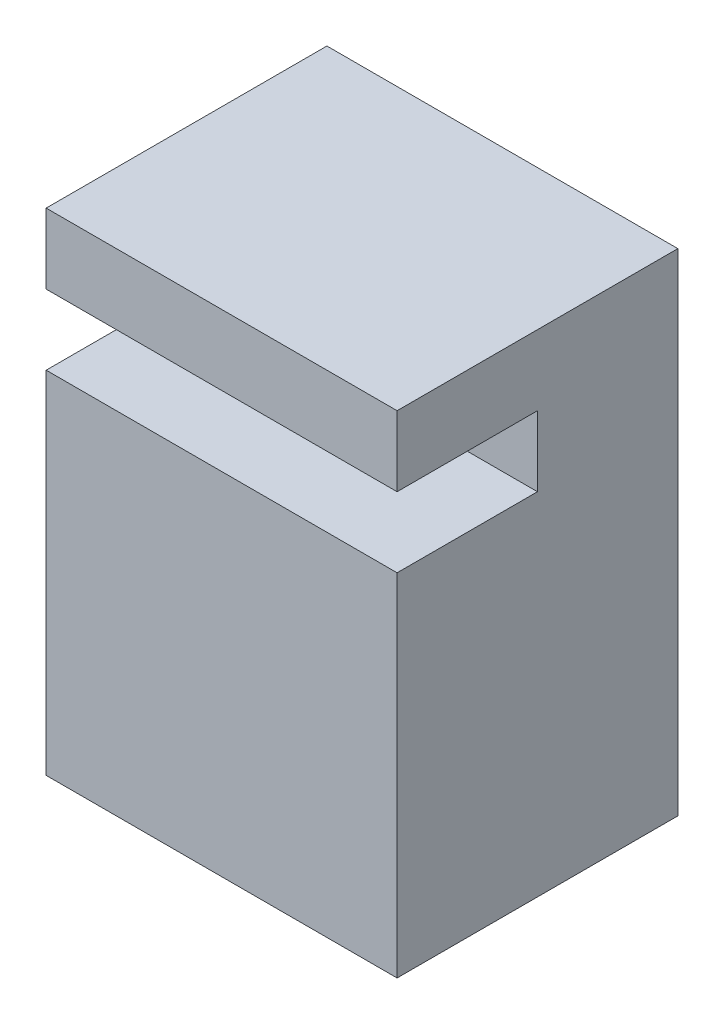
ISO-10303-21;
HEADER;
FILE_DESCRIPTION(('STEP AP214'),'2;1');
FILE_NAME('part.step','',(''),(''),'','','');
FILE_SCHEMA(('AUTOMOTIVE_DESIGN { 1 0 10303 214 1 1 1 1 }'));
ENDSEC;
DATA;
#1=APPLICATION_CONTEXT('core data for automotive mechanical design processes');
#2=APPLICATION_PROTOCOL_DEFINITION('international standard','automotive_design',2000,#1);
#3=PRODUCT_CONTEXT('',#1,'mechanical');
#4=PRODUCT('Part','Part','',(#3));
#5=PRODUCT_RELATED_PRODUCT_CATEGORY('part','',(#4));
#6=PRODUCT_DEFINITION_FORMATION('','',#4);
#7=PRODUCT_DEFINITION_CONTEXT('part definition',#1,'design');
#8=PRODUCT_DEFINITION('design','',#6,#7);
#9=PRODUCT_DEFINITION_SHAPE('','',#8);
#10=(LENGTH_UNIT() NAMED_UNIT(*) SI_UNIT(.MILLI.,.METRE.));
#11=(NAMED_UNIT(*) PLANE_ANGLE_UNIT() SI_UNIT($,.RADIAN.));
#12=(NAMED_UNIT(*) SI_UNIT($,.STERADIAN.) SOLID_ANGLE_UNIT());
#13=UNCERTAINTY_MEASURE_WITH_UNIT(LENGTH_MEASURE(1.E-05),#10,'distance_accuracy_value','');
#14=(GEOMETRIC_REPRESENTATION_CONTEXT(3) GLOBAL_UNCERTAINTY_ASSIGNED_CONTEXT((#13)) GLOBAL_UNIT_ASSIGNED_CONTEXT((#10,
#11,#12)) REPRESENTATION_CONTEXT('',''));
#15=CARTESIAN_POINT('',(0.,0.,0.));
#16=DIRECTION('',(0.,0.,1.));
#17=DIRECTION('',(1.,0.,0.));
#18=AXIS2_PLACEMENT_3D('',#15,#16,#17);
#19=CARTESIAN_POINT('',(0.,0.,0.));
#20=DIRECTION('',(0.,0.,1.));
#21=DIRECTION('',(1.,0.,0.));
#22=AXIS2_PLACEMENT_3D('',#19,#20,#21);
#23=PLANE('',#22);
#24=DIRECTION('',(1.,0.,0.));
#25=VECTOR('',#24,1.);
#26=CARTESIAN_POINT('',(-25.,15.,0.));
#27=LINE('',#26,#25);
#28=CARTESIAN_POINT('',(-25.,15.,0.));
#29=VERTEX_POINT('',#28);
#30=CARTESIAN_POINT('',(25.,15.,0.));
#31=VERTEX_POINT('',#30);
#32=EDGE_CURVE('E130',#29,#31,#27,.T.);
#33=ORIENTED_EDGE('',*,*,#32,.F.);
#34=DIRECTION('',(0.,-1.,0.));
#35=VECTOR('',#34,1.);
#36=CARTESIAN_POINT('',(-25.,35.,0.));
#37=LINE('',#36,#35);
#38=CARTESIAN_POINT('',(-25.,-35.,0.));
#39=VERTEX_POINT('',#38);
#40=EDGE_CURVE('E165',#29,#39,#37,.T.);
#41=ORIENTED_EDGE('',*,*,#40,.T.);
#42=DIRECTION('',(1.,0.,0.));
#43=VECTOR('',#42,1.);
#44=CARTESIAN_POINT('',(-25.,-35.,0.));
#45=LINE('',#44,#43);
#46=CARTESIAN_POINT('',(25.,-35.,0.));
#47=VERTEX_POINT('',#46);
#48=EDGE_CURVE('E147',#39,#47,#45,.T.);
#49=ORIENTED_EDGE('',*,*,#48,.T.);
#50=DIRECTION('',(0.,1.,0.));
#51=VECTOR('',#50,1.);
#52=CARTESIAN_POINT('',(25.,35.,0.));
#53=LINE('',#52,#51);
#54=EDGE_CURVE('E157',#47,#31,#53,.T.);
#55=ORIENTED_EDGE('',*,*,#54,.T.);
#56=EDGE_LOOP('',(#33,#41,#49,#55));
#57=FACE_BOUND('',#56,.T.);
#58=ADVANCED_FACE('F39',(#57),#23,.T.);
#59=CARTESIAN_POINT('',(25.,35.,-40.));
#60=DIRECTION('',(1.,0.,0.));
#61=DIRECTION('',(0.,1.,0.));
#62=AXIS2_PLACEMENT_3D('',#59,#60,#61);
#63=PLANE('',#62);
#64=DIRECTION('',(0.,0.,1.));
#65=VECTOR('',#64,1.);
#66=CARTESIAN_POINT('',(25.,15.,-20.));
#67=LINE('',#66,#65);
#68=CARTESIAN_POINT('',(25.,15.,-20.));
#69=VERTEX_POINT('',#68);
#70=EDGE_CURVE('E184',#69,#31,#67,.T.);
#71=ORIENTED_EDGE('',*,*,#70,.T.);
#72=ORIENTED_EDGE('',*,*,#54,.F.);
#73=DIRECTION('',(0.,0.,1.));
#74=VECTOR('',#73,1.);
#75=CARTESIAN_POINT('',(25.,-35.,-40.));
#76=LINE('',#75,#74);
#77=CARTESIAN_POINT('',(25.,-35.,-40.));
#78=VERTEX_POINT('',#77);
#79=EDGE_CURVE('E11',#78,#47,#76,.T.);
#80=ORIENTED_EDGE('',*,*,#79,.F.);
#81=DIRECTION('',(0.,1.,0.));
#82=VECTOR('',#81,1.);
#83=CARTESIAN_POINT('',(25.,35.,-40.));
#84=LINE('',#83,#82);
#85=CARTESIAN_POINT('',(25.,35.,-40.));
#86=VERTEX_POINT('',#85);
#87=EDGE_CURVE('E143',#78,#86,#84,.T.);
#88=ORIENTED_EDGE('',*,*,#87,.T.);
#89=DIRECTION('',(0.,0.,1.));
#90=VECTOR('',#89,1.);
#91=CARTESIAN_POINT('',(25.,35.,-40.));
#92=LINE('',#91,#90);
#93=CARTESIAN_POINT('',(25.,35.,0.));
#94=VERTEX_POINT('',#93);
#95=EDGE_CURVE('E43',#86,#94,#92,.T.);
#96=ORIENTED_EDGE('',*,*,#95,.T.);
#97=CARTESIAN_POINT('',(25.,25.,0.));
#98=VERTEX_POINT('',#97);
#99=EDGE_CURVE('E133',#98,#94,#53,.T.);
#100=ORIENTED_EDGE('',*,*,#99,.F.);
#101=DIRECTION('',(0.,0.,1.));
#102=VECTOR('',#101,1.);
#103=CARTESIAN_POINT('',(25.,25.,-20.));
#104=LINE('',#103,#102);
#105=CARTESIAN_POINT('',(25.,25.,-20.));
#106=VERTEX_POINT('',#105);
#107=EDGE_CURVE('E57',#106,#98,#104,.T.);
#108=ORIENTED_EDGE('',*,*,#107,.F.);
#109=DIRECTION('',(0.,1.,0.));
#110=VECTOR('',#109,1.);
#111=CARTESIAN_POINT('',(25.,25.,-20.));
#112=LINE('',#111,#110);
#113=EDGE_CURVE('E121',#69,#106,#112,.T.);
#114=ORIENTED_EDGE('',*,*,#113,.F.);
#115=EDGE_LOOP('',(#71,#72,#80,#88,#96,#100,#108,#114));
#116=FACE_BOUND('',#115,.T.);
#117=ADVANCED_FACE('F41',(#116),#63,.T.);
#118=CARTESIAN_POINT('',(-25.,-35.,-40.));
#119=DIRECTION('',(0.,-1.,0.));
#120=DIRECTION('',(0.,0.,-1.));
#121=AXIS2_PLACEMENT_3D('',#118,#119,#120);
#122=PLANE('',#121);
#123=ORIENTED_EDGE('',*,*,#48,.F.);
#124=DIRECTION('',(0.,0.,1.));
#125=VECTOR('',#124,1.);
#126=CARTESIAN_POINT('',(-25.,-35.,-40.));
#127=LINE('',#126,#125);
#128=CARTESIAN_POINT('',(-25.,-35.,-40.));
#129=VERTEX_POINT('',#128);
#130=EDGE_CURVE('E49',#129,#39,#127,.T.);
#131=ORIENTED_EDGE('',*,*,#130,.F.);
#132=DIRECTION('',(1.,0.,0.));
#133=VECTOR('',#132,1.);
#134=CARTESIAN_POINT('',(-25.,-35.,-40.));
#135=LINE('',#134,#133);
#136=EDGE_CURVE('E154',#129,#78,#135,.T.);
#137=ORIENTED_EDGE('',*,*,#136,.T.);
#138=ORIENTED_EDGE('',*,*,#79,.T.);
#139=EDGE_LOOP('',(#123,#131,#137,#138));
#140=FACE_BOUND('',#139,.T.);
#141=ADVANCED_FACE('F203',(#140),#122,.T.);
#142=CARTESIAN_POINT('',(-25.,35.,-40.));
#143=DIRECTION('',(-1.,0.,0.));
#144=DIRECTION('',(0.,-1.,0.));
#145=AXIS2_PLACEMENT_3D('',#142,#143,#144);
#146=PLANE('',#145);
#147=DIRECTION('',(0.,0.,1.));
#148=VECTOR('',#147,1.);
#149=CARTESIAN_POINT('',(-25.,15.,-20.));
#150=LINE('',#149,#148);
#151=CARTESIAN_POINT('',(-25.,15.,-20.));
#152=VERTEX_POINT('',#151);
#153=EDGE_CURVE('E138',#152,#29,#150,.T.);
#154=ORIENTED_EDGE('',*,*,#153,.F.);
#155=DIRECTION('',(0.,-1.,0.));
#156=VECTOR('',#155,1.);
#157=CARTESIAN_POINT('',(-25.,25.,-20.));
#158=LINE('',#157,#156);
#159=CARTESIAN_POINT('',(-25.,25.,-20.));
#160=VERTEX_POINT('',#159);
#161=EDGE_CURVE('E120',#160,#152,#158,.T.);
#162=ORIENTED_EDGE('',*,*,#161,.F.);
#163=DIRECTION('',(0.,0.,1.));
#164=VECTOR('',#163,1.);
#165=CARTESIAN_POINT('',(-25.,25.,-20.));
#166=LINE('',#165,#164);
#167=CARTESIAN_POINT('',(-25.,25.,0.));
#168=VERTEX_POINT('',#167);
#169=EDGE_CURVE('E116',#160,#168,#166,.T.);
#170=ORIENTED_EDGE('',*,*,#169,.T.);
#171=CARTESIAN_POINT('',(-25.,35.,0.));
#172=VERTEX_POINT('',#171);
#173=EDGE_CURVE('E166',#172,#168,#37,.T.);
#174=ORIENTED_EDGE('',*,*,#173,.F.);
#175=DIRECTION('',(0.,0.,1.));
#176=VECTOR('',#175,1.);
#177=CARTESIAN_POINT('',(-25.,35.,-40.));
#178=LINE('',#177,#176);
#179=CARTESIAN_POINT('',(-25.,35.,-40.));
#180=VERTEX_POINT('',#179);
#181=EDGE_CURVE('E175',#180,#172,#178,.T.);
#182=ORIENTED_EDGE('',*,*,#181,.F.);
#183=DIRECTION('',(0.,-1.,0.));
#184=VECTOR('',#183,1.);
#185=CARTESIAN_POINT('',(-25.,35.,-40.));
#186=LINE('',#185,#184);
#187=EDGE_CURVE('E150',#180,#129,#186,.T.);
#188=ORIENTED_EDGE('',*,*,#187,.T.);
#189=ORIENTED_EDGE('',*,*,#130,.T.);
#190=ORIENTED_EDGE('',*,*,#40,.F.);
#191=EDGE_LOOP('',(#154,#162,#170,#174,#182,#188,#189,#190));
#192=FACE_BOUND('',#191,.T.);
#193=ADVANCED_FACE('F200',(#192),#146,.T.);
#194=CARTESIAN_POINT('',(-25.,35.,-40.));
#195=DIRECTION('',(0.,1.,0.));
#196=DIRECTION('',(0.,0.,1.));
#197=AXIS2_PLACEMENT_3D('',#194,#195,#196);
#198=PLANE('',#197);
#199=DIRECTION('',(-1.,0.,0.));
#200=VECTOR('',#199,1.);
#201=CARTESIAN_POINT('',(-25.,35.,0.));
#202=LINE('',#201,#200);
#203=EDGE_CURVE('E161',#94,#172,#202,.T.);
#204=ORIENTED_EDGE('',*,*,#203,.F.);
#205=ORIENTED_EDGE('',*,*,#95,.F.);
#206=DIRECTION('',(-1.,0.,0.));
#207=VECTOR('',#206,1.);
#208=CARTESIAN_POINT('',(-25.,35.,-40.));
#209=LINE('',#208,#207);
#210=EDGE_CURVE('E146',#86,#180,#209,.T.);
#211=ORIENTED_EDGE('',*,*,#210,.T.);
#212=ORIENTED_EDGE('',*,*,#181,.T.);
#213=EDGE_LOOP('',(#204,#205,#211,#212));
#214=FACE_BOUND('',#213,.T.);
#215=ADVANCED_FACE('F179',(#214),#198,.T.);
#216=CARTESIAN_POINT('',(0.,0.,-40.));
#217=DIRECTION('',(0.,0.,1.));
#218=DIRECTION('',(1.,0.,0.));
#219=AXIS2_PLACEMENT_3D('',#216,#217,#218);
#220=PLANE('',#219);
#221=ORIENTED_EDGE('',*,*,#87,.F.);
#222=ORIENTED_EDGE('',*,*,#136,.F.);
#223=ORIENTED_EDGE('',*,*,#187,.F.);
#224=ORIENTED_EDGE('',*,*,#210,.F.);
#225=EDGE_LOOP('',(#221,#222,#223,#224));
#226=FACE_BOUND('',#225,.T.);
#227=ADVANCED_FACE('F207',(#226),#220,.F.);
#228=DIRECTION('',(-1.,0.,0.));
#229=VECTOR('',#228,1.);
#230=CARTESIAN_POINT('',(-25.,25.,0.));
#231=LINE('',#230,#229);
#232=EDGE_CURVE('E182',#98,#168,#231,.T.);
#233=ORIENTED_EDGE('',*,*,#232,.F.);
#234=ORIENTED_EDGE('',*,*,#99,.T.);
#235=ORIENTED_EDGE('',*,*,#203,.T.);
#236=ORIENTED_EDGE('',*,*,#173,.T.);
#237=EDGE_LOOP('',(#233,#234,#235,#236));
#238=FACE_BOUND('',#237,.T.);
#239=ADVANCED_FACE('F181',(#238),#23,.T.);
#240=CARTESIAN_POINT('',(-25.,15.,-20.));
#241=DIRECTION('',(0.,-1.,0.));
#242=DIRECTION('',(0.,0.,-1.));
#243=AXIS2_PLACEMENT_3D('',#240,#241,#242);
#244=PLANE('',#243);
#245=ORIENTED_EDGE('',*,*,#32,.T.);
#246=ORIENTED_EDGE('',*,*,#70,.F.);
#247=DIRECTION('',(1.,0.,0.));
#248=VECTOR('',#247,1.);
#249=CARTESIAN_POINT('',(-25.,15.,-20.));
#250=LINE('',#249,#248);
#251=EDGE_CURVE('E127',#152,#69,#250,.T.);
#252=ORIENTED_EDGE('',*,*,#251,.F.);
#253=ORIENTED_EDGE('',*,*,#153,.T.);
#254=EDGE_LOOP('',(#245,#246,#252,#253));
#255=FACE_BOUND('',#254,.T.);
#256=ADVANCED_FACE('F197',(#255),#244,.F.);
#257=CARTESIAN_POINT('',(-25.,25.,-20.));
#258=DIRECTION('',(0.,1.,0.));
#259=DIRECTION('',(0.,0.,1.));
#260=AXIS2_PLACEMENT_3D('',#257,#258,#259);
#261=PLANE('',#260);
#262=ORIENTED_EDGE('',*,*,#232,.T.);
#263=ORIENTED_EDGE('',*,*,#169,.F.);
#264=DIRECTION('',(-1.,0.,0.));
#265=VECTOR('',#264,1.);
#266=CARTESIAN_POINT('',(-25.,25.,-20.));
#267=LINE('',#266,#265);
#268=EDGE_CURVE('E112',#106,#160,#267,.T.);
#269=ORIENTED_EDGE('',*,*,#268,.F.);
#270=ORIENTED_EDGE('',*,*,#107,.T.);
#271=EDGE_LOOP('',(#262,#263,#269,#270));
#272=FACE_BOUND('',#271,.T.);
#273=ADVANCED_FACE('F114',(#272),#261,.F.);
#274=CARTESIAN_POINT('',(0.,0.,-20.));
#275=DIRECTION('',(0.,0.,1.));
#276=DIRECTION('',(1.,0.,0.));
#277=AXIS2_PLACEMENT_3D('',#274,#275,#276);
#278=PLANE('',#277);
#279=ORIENTED_EDGE('',*,*,#113,.T.);
#280=ORIENTED_EDGE('',*,*,#268,.T.);
#281=ORIENTED_EDGE('',*,*,#161,.T.);
#282=ORIENTED_EDGE('',*,*,#251,.T.);
#283=EDGE_LOOP('',(#279,#280,#281,#282));
#284=FACE_BOUND('',#283,.T.);
#285=ADVANCED_FACE('F125',(#284),#278,.T.);
#286=CLOSED_SHELL('',(#58,#117,#141,#193,#215,#227,#239,#256,#273,#285));
#287=MANIFOLD_SOLID_BREP('B2',#286);
#288=ADVANCED_BREP_SHAPE_REPRESENTATION('',(#18,#287),#14);
#289=SHAPE_DEFINITION_REPRESENTATION(#9,#288);
ENDSEC;
END-ISO-10303-21;
